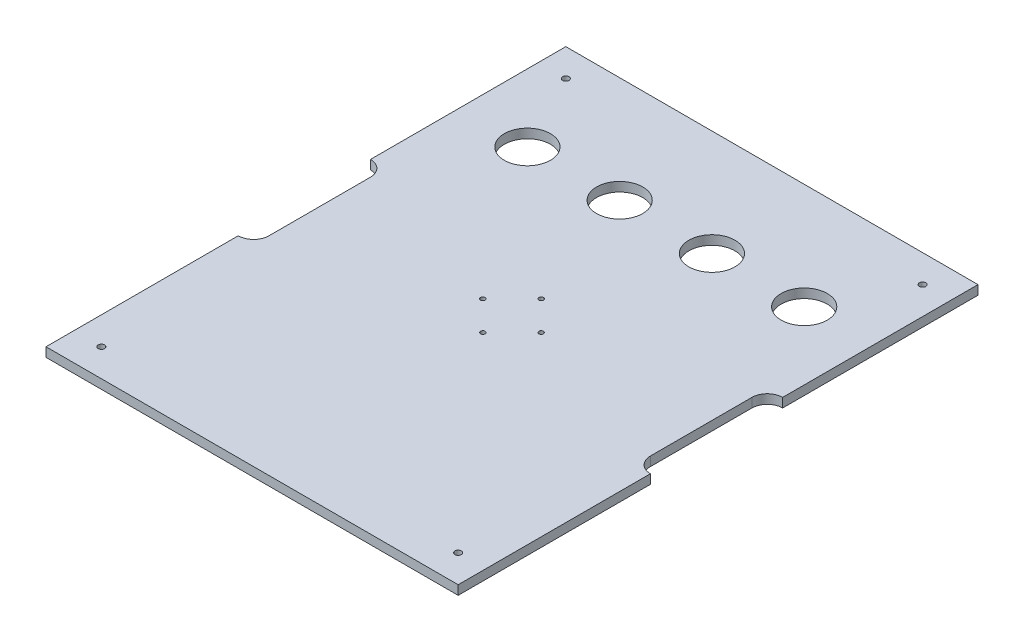
ISO-10303-21;
HEADER;
FILE_DESCRIPTION(('STEP AP214'),'2;1');
FILE_NAME('part.step','',(''),(''),'','','');
FILE_SCHEMA(('AUTOMOTIVE_DESIGN { 1 0 10303 214 1 1 1 1 }'));
ENDSEC;
DATA;
#1=APPLICATION_CONTEXT('core data for automotive mechanical design processes');
#2=APPLICATION_PROTOCOL_DEFINITION('international standard','automotive_design',2000,#1);
#3=PRODUCT_CONTEXT('',#1,'mechanical');
#4=PRODUCT('Part','Part','',(#3));
#5=PRODUCT_RELATED_PRODUCT_CATEGORY('part','',(#4));
#6=PRODUCT_DEFINITION_FORMATION('','',#4);
#7=PRODUCT_DEFINITION_CONTEXT('part definition',#1,'design');
#8=PRODUCT_DEFINITION('design','',#6,#7);
#9=PRODUCT_DEFINITION_SHAPE('','',#8);
#10=(LENGTH_UNIT() NAMED_UNIT(*) SI_UNIT(.MILLI.,.METRE.));
#11=(NAMED_UNIT(*) PLANE_ANGLE_UNIT() SI_UNIT($,.RADIAN.));
#12=(NAMED_UNIT(*) SI_UNIT($,.STERADIAN.) SOLID_ANGLE_UNIT());
#13=UNCERTAINTY_MEASURE_WITH_UNIT(LENGTH_MEASURE(1.E-05),#10,'distance_accuracy_value','');
#14=(GEOMETRIC_REPRESENTATION_CONTEXT(3) GLOBAL_UNCERTAINTY_ASSIGNED_CONTEXT((#13)) GLOBAL_UNIT_ASSIGNED_CONTEXT((#10,
#11,#12)) REPRESENTATION_CONTEXT('',''));
#15=CARTESIAN_POINT('',(0.,0.,0.));
#16=DIRECTION('',(0.,0.,1.));
#17=DIRECTION('',(1.,0.,0.));
#18=AXIS2_PLACEMENT_3D('',#15,#16,#17);
#19=CARTESIAN_POINT('',(134.,6.,-42.));
#20=DIRECTION('',(-1.,0.,0.));
#21=DIRECTION('',(0.,0.,1.));
#22=AXIS2_PLACEMENT_3D('',#19,#20,#21);
#23=PLANE('',#22);
#24=DIRECTION('',(0.,0.,-1.));
#25=VECTOR('',#24,1.);
#26=CARTESIAN_POINT('',(134.,0.,-42.));
#27=LINE('',#26,#25);
#28=CARTESIAN_POINT('',(134.,0.,-42.));
#29=VERTEX_POINT('',#28);
#30=CARTESIAN_POINT('',(134.,0.,-169.));
#31=VERTEX_POINT('',#30);
#32=EDGE_CURVE('E159',#29,#31,#27,.T.);
#33=ORIENTED_EDGE('',*,*,#32,.T.);
#34=DIRECTION('',(0.,-1.,0.));
#35=VECTOR('',#34,1.);
#36=CARTESIAN_POINT('',(134.,6.,-169.));
#37=LINE('',#36,#35);
#38=CARTESIAN_POINT('',(134.,6.,-169.));
#39=VERTEX_POINT('',#38);
#40=EDGE_CURVE('E11',#39,#31,#37,.T.);
#41=ORIENTED_EDGE('',*,*,#40,.F.);
#42=DIRECTION('',(0.,0.,-1.));
#43=VECTOR('',#42,1.);
#44=CARTESIAN_POINT('',(134.,6.,-42.));
#45=LINE('',#44,#43);
#46=CARTESIAN_POINT('',(134.,6.,-42.));
#47=VERTEX_POINT('',#46);
#48=EDGE_CURVE('E182',#47,#39,#45,.T.);
#49=ORIENTED_EDGE('',*,*,#48,.F.);
#50=DIRECTION('',(0.,-1.,0.));
#51=VECTOR('',#50,1.);
#52=CARTESIAN_POINT('',(134.,6.,-42.));
#53=LINE('',#52,#51);
#54=EDGE_CURVE('E155',#47,#29,#53,.T.);
#55=ORIENTED_EDGE('',*,*,#54,.T.);
#56=EDGE_LOOP('',(#33,#41,#49,#55));
#57=FACE_BOUND('',#56,.T.);
#58=ADVANCED_FACE('F39',(#57),#23,.F.);
#59=CARTESIAN_POINT('',(-134.,6.,-169.));
#60=DIRECTION('',(0.,0.,1.));
#61=DIRECTION('',(1.,0.,0.));
#62=AXIS2_PLACEMENT_3D('',#59,#60,#61);
#63=PLANE('',#62);
#64=DIRECTION('',(-1.,0.,0.));
#65=VECTOR('',#64,1.);
#66=CARTESIAN_POINT('',(-134.,0.,-169.));
#67=LINE('',#66,#65);
#68=CARTESIAN_POINT('',(-134.,0.,-169.));
#69=VERTEX_POINT('',#68);
#70=EDGE_CURVE('E162',#31,#69,#67,.T.);
#71=ORIENTED_EDGE('',*,*,#70,.T.);
#72=DIRECTION('',(0.,-1.,0.));
#73=VECTOR('',#72,1.);
#74=CARTESIAN_POINT('',(-134.,6.,-169.));
#75=LINE('',#74,#73);
#76=CARTESIAN_POINT('',(-134.,6.,-169.));
#77=VERTEX_POINT('',#76);
#78=EDGE_CURVE('E47',#77,#69,#75,.T.);
#79=ORIENTED_EDGE('',*,*,#78,.F.);
#80=DIRECTION('',(-1.,0.,0.));
#81=VECTOR('',#80,1.);
#82=CARTESIAN_POINT('',(-134.,6.,-169.));
#83=LINE('',#82,#81);
#84=EDGE_CURVE('E110',#39,#77,#83,.T.);
#85=ORIENTED_EDGE('',*,*,#84,.F.);
#86=ORIENTED_EDGE('',*,*,#40,.T.);
#87=EDGE_LOOP('',(#71,#79,#85,#86));
#88=FACE_BOUND('',#87,.T.);
#89=ADVANCED_FACE('F261',(#88),#63,.F.);
#90=CARTESIAN_POINT('',(-134.,6.,-42.));
#91=DIRECTION('',(1.,0.,0.));
#92=DIRECTION('',(0.,0.,-1.));
#93=AXIS2_PLACEMENT_3D('',#90,#91,#92);
#94=PLANE('',#93);
#95=DIRECTION('',(0.,0.,1.));
#96=VECTOR('',#95,1.);
#97=CARTESIAN_POINT('',(-134.,0.,-42.));
#98=LINE('',#97,#96);
#99=CARTESIAN_POINT('',(-134.,0.,-42.));
#100=VERTEX_POINT('',#99);
#101=EDGE_CURVE('E165',#69,#100,#98,.T.);
#102=ORIENTED_EDGE('',*,*,#101,.T.);
#103=DIRECTION('',(0.,-1.,0.));
#104=VECTOR('',#103,1.);
#105=CARTESIAN_POINT('',(-134.,6.,-42.));
#106=LINE('',#105,#104);
#107=CARTESIAN_POINT('',(-134.,6.,-42.));
#108=VERTEX_POINT('',#107);
#109=EDGE_CURVE('E201',#108,#100,#106,.T.);
#110=ORIENTED_EDGE('',*,*,#109,.F.);
#111=DIRECTION('',(0.,0.,1.));
#112=VECTOR('',#111,1.);
#113=CARTESIAN_POINT('',(-134.,6.,-42.));
#114=LINE('',#113,#112);
#115=EDGE_CURVE('E209',#77,#108,#114,.T.);
#116=ORIENTED_EDGE('',*,*,#115,.F.);
#117=ORIENTED_EDGE('',*,*,#78,.T.);
#118=EDGE_LOOP('',(#102,#110,#116,#117));
#119=FACE_BOUND('',#118,.T.);
#120=ADVANCED_FACE('F207',(#119),#94,.F.);
#121=CARTESIAN_POINT('',(-134.,6.,-32.));
#122=DIRECTION('',(0.,-1.,0.));
#123=DIRECTION('',(0.,0.,-1.));
#124=AXIS2_PLACEMENT_3D('',#121,#122,#123);
#125=CYLINDRICAL_SURFACE('',#124,10.);
#126=CARTESIAN_POINT('',(-134.,0.,-32.));
#127=DIRECTION('',(0.,-1.,0.));
#128=DIRECTION('',(0.,0.,1.));
#129=AXIS2_PLACEMENT_3D('',#126,#127,#128);
#130=CIRCLE('',#129,10.);
#131=CARTESIAN_POINT('',(-124.,0.,-32.));
#132=VERTEX_POINT('',#131);
#133=EDGE_CURVE('E167',#100,#132,#130,.T.);
#134=ORIENTED_EDGE('',*,*,#133,.T.);
#135=DIRECTION('',(0.,-1.,0.));
#136=VECTOR('',#135,1.);
#137=CARTESIAN_POINT('',(-124.,6.,-32.));
#138=LINE('',#137,#136);
#139=CARTESIAN_POINT('',(-124.,6.,-32.));
#140=VERTEX_POINT('',#139);
#141=EDGE_CURVE('E198',#140,#132,#138,.T.);
#142=ORIENTED_EDGE('',*,*,#141,.F.);
#143=CARTESIAN_POINT('',(-134.,6.,-32.));
#144=DIRECTION('',(0.,-1.,0.));
#145=DIRECTION('',(0.,0.,1.));
#146=AXIS2_PLACEMENT_3D('',#143,#144,#145);
#147=CIRCLE('',#146,10.);
#148=EDGE_CURVE('E227',#108,#140,#147,.T.);
#149=ORIENTED_EDGE('',*,*,#148,.F.);
#150=ORIENTED_EDGE('',*,*,#109,.T.);
#151=EDGE_LOOP('',(#134,#142,#149,#150));
#152=FACE_BOUND('',#151,.T.);
#153=ADVANCED_FACE('F218',(#152),#125,.F.);
#154=CARTESIAN_POINT('',(-124.,6.,34.));
#155=DIRECTION('',(1.,0.,0.));
#156=DIRECTION('',(0.,0.,-1.));
#157=AXIS2_PLACEMENT_3D('',#154,#155,#156);
#158=PLANE('',#157);
#159=DIRECTION('',(0.,0.,1.));
#160=VECTOR('',#159,1.);
#161=CARTESIAN_POINT('',(-124.,0.,34.));
#162=LINE('',#161,#160);
#163=CARTESIAN_POINT('',(-124.,0.,34.));
#164=VERTEX_POINT('',#163);
#165=EDGE_CURVE('E169',#132,#164,#162,.T.);
#166=ORIENTED_EDGE('',*,*,#165,.T.);
#167=DIRECTION('',(0.,-1.,0.));
#168=VECTOR('',#167,1.);
#169=CARTESIAN_POINT('',(-124.,6.,34.));
#170=LINE('',#169,#168);
#171=CARTESIAN_POINT('',(-124.,6.,34.));
#172=VERTEX_POINT('',#171);
#173=EDGE_CURVE('E195',#172,#164,#170,.T.);
#174=ORIENTED_EDGE('',*,*,#173,.F.);
#175=DIRECTION('',(0.,0.,1.));
#176=VECTOR('',#175,1.);
#177=CARTESIAN_POINT('',(-124.,6.,34.));
#178=LINE('',#177,#176);
#179=EDGE_CURVE('E224',#140,#172,#178,.T.);
#180=ORIENTED_EDGE('',*,*,#179,.F.);
#181=ORIENTED_EDGE('',*,*,#141,.T.);
#182=EDGE_LOOP('',(#166,#174,#180,#181));
#183=FACE_BOUND('',#182,.T.);
#184=ADVANCED_FACE('F222',(#183),#158,.F.);
#185=CARTESIAN_POINT('',(-134.,6.,34.));
#186=DIRECTION('',(0.,-1.,0.));
#187=DIRECTION('',(0.,0.,-1.));
#188=AXIS2_PLACEMENT_3D('',#185,#186,#187);
#189=CYLINDRICAL_SURFACE('',#188,10.);
#190=CARTESIAN_POINT('',(-134.,0.,34.));
#191=DIRECTION('',(0.,-1.,0.));
#192=DIRECTION('',(0.,0.,1.));
#193=AXIS2_PLACEMENT_3D('',#190,#191,#192);
#194=CIRCLE('',#193,10.);
#195=CARTESIAN_POINT('',(-134.,0.,44.));
#196=VERTEX_POINT('',#195);
#197=EDGE_CURVE('E171',#164,#196,#194,.T.);
#198=ORIENTED_EDGE('',*,*,#197,.T.);
#199=DIRECTION('',(0.,-1.,0.));
#200=VECTOR('',#199,1.);
#201=CARTESIAN_POINT('',(-134.,6.,44.));
#202=LINE('',#201,#200);
#203=CARTESIAN_POINT('',(-134.,6.,44.));
#204=VERTEX_POINT('',#203);
#205=EDGE_CURVE('E192',#204,#196,#202,.T.);
#206=ORIENTED_EDGE('',*,*,#205,.F.);
#207=CARTESIAN_POINT('',(-134.,6.,34.));
#208=DIRECTION('',(0.,-1.,0.));
#209=DIRECTION('',(0.,0.,1.));
#210=AXIS2_PLACEMENT_3D('',#207,#208,#209);
#211=CIRCLE('',#210,10.);
#212=EDGE_CURVE('E226',#172,#204,#211,.T.);
#213=ORIENTED_EDGE('',*,*,#212,.F.);
#214=ORIENTED_EDGE('',*,*,#173,.T.);
#215=EDGE_LOOP('',(#198,#206,#213,#214));
#216=FACE_BOUND('',#215,.T.);
#217=ADVANCED_FACE('F274',(#216),#189,.F.);
#218=CARTESIAN_POINT('',(-134.,6.,169.));
#219=DIRECTION('',(1.,0.,0.));
#220=DIRECTION('',(0.,0.,-1.));
#221=AXIS2_PLACEMENT_3D('',#218,#219,#220);
#222=PLANE('',#221);
#223=DIRECTION('',(0.,0.,1.));
#224=VECTOR('',#223,1.);
#225=CARTESIAN_POINT('',(-134.,0.,169.));
#226=LINE('',#225,#224);
#227=CARTESIAN_POINT('',(-134.,0.,169.));
#228=VERTEX_POINT('',#227);
#229=EDGE_CURVE('E173',#196,#228,#226,.T.);
#230=ORIENTED_EDGE('',*,*,#229,.T.);
#231=DIRECTION('',(0.,-1.,0.));
#232=VECTOR('',#231,1.);
#233=CARTESIAN_POINT('',(-134.,6.,169.));
#234=LINE('',#233,#232);
#235=CARTESIAN_POINT('',(-134.,6.,169.));
#236=VERTEX_POINT('',#235);
#237=EDGE_CURVE('E189',#236,#228,#234,.T.);
#238=ORIENTED_EDGE('',*,*,#237,.F.);
#239=DIRECTION('',(0.,0.,1.));
#240=VECTOR('',#239,1.);
#241=CARTESIAN_POINT('',(-134.,6.,169.));
#242=LINE('',#241,#240);
#243=EDGE_CURVE('E229',#204,#236,#242,.T.);
#244=ORIENTED_EDGE('',*,*,#243,.F.);
#245=ORIENTED_EDGE('',*,*,#205,.T.);
#246=EDGE_LOOP('',(#230,#238,#244,#245));
#247=FACE_BOUND('',#246,.T.);
#248=ADVANCED_FACE('F277',(#247),#222,.F.);
#249=CARTESIAN_POINT('',(-134.,6.,169.));
#250=DIRECTION('',(0.,0.,-1.));
#251=DIRECTION('',(-1.,0.,0.));
#252=AXIS2_PLACEMENT_3D('',#249,#250,#251);
#253=PLANE('',#252);
#254=DIRECTION('',(1.,0.,0.));
#255=VECTOR('',#254,1.);
#256=CARTESIAN_POINT('',(-134.,0.,169.));
#257=LINE('',#256,#255);
#258=CARTESIAN_POINT('',(134.,0.,169.));
#259=VERTEX_POINT('',#258);
#260=EDGE_CURVE('E175',#228,#259,#257,.T.);
#261=ORIENTED_EDGE('',*,*,#260,.T.);
#262=DIRECTION('',(0.,-1.,0.));
#263=VECTOR('',#262,1.);
#264=CARTESIAN_POINT('',(134.,6.,169.));
#265=LINE('',#264,#263);
#266=CARTESIAN_POINT('',(134.,6.,169.));
#267=VERTEX_POINT('',#266);
#268=EDGE_CURVE('E186',#267,#259,#265,.T.);
#269=ORIENTED_EDGE('',*,*,#268,.F.);
#270=DIRECTION('',(1.,0.,0.));
#271=VECTOR('',#270,1.);
#272=CARTESIAN_POINT('',(-134.,6.,169.));
#273=LINE('',#272,#271);
#274=EDGE_CURVE('E235',#236,#267,#273,.T.);
#275=ORIENTED_EDGE('',*,*,#274,.F.);
#276=ORIENTED_EDGE('',*,*,#237,.T.);
#277=EDGE_LOOP('',(#261,#269,#275,#276));
#278=FACE_BOUND('',#277,.T.);
#279=ADVANCED_FACE('F241',(#278),#253,.F.);
#280=CARTESIAN_POINT('',(134.,6.,169.));
#281=DIRECTION('',(-1.,0.,0.));
#282=DIRECTION('',(0.,0.,1.));
#283=AXIS2_PLACEMENT_3D('',#280,#281,#282);
#284=PLANE('',#283);
#285=DIRECTION('',(0.,0.,-1.));
#286=VECTOR('',#285,1.);
#287=CARTESIAN_POINT('',(134.,0.,169.));
#288=LINE('',#287,#286);
#289=CARTESIAN_POINT('',(134.,0.,44.));
#290=VERTEX_POINT('',#289);
#291=EDGE_CURVE('E177',#259,#290,#288,.T.);
#292=ORIENTED_EDGE('',*,*,#291,.T.);
#293=DIRECTION('',(0.,-1.,0.));
#294=VECTOR('',#293,1.);
#295=CARTESIAN_POINT('',(134.,6.,44.));
#296=LINE('',#295,#294);
#297=CARTESIAN_POINT('',(134.,6.,44.));
#298=VERTEX_POINT('',#297);
#299=EDGE_CURVE('E150',#298,#290,#296,.T.);
#300=ORIENTED_EDGE('',*,*,#299,.F.);
#301=DIRECTION('',(0.,0.,-1.));
#302=VECTOR('',#301,1.);
#303=CARTESIAN_POINT('',(134.,6.,169.));
#304=LINE('',#303,#302);
#305=EDGE_CURVE('E141',#267,#298,#304,.T.);
#306=ORIENTED_EDGE('',*,*,#305,.F.);
#307=ORIENTED_EDGE('',*,*,#268,.T.);
#308=EDGE_LOOP('',(#292,#300,#306,#307));
#309=FACE_BOUND('',#308,.T.);
#310=ADVANCED_FACE('F245',(#309),#284,.F.);
#311=CARTESIAN_POINT('',(134.,6.,34.));
#312=DIRECTION('',(0.,-1.,0.));
#313=DIRECTION('',(0.,0.,-1.));
#314=AXIS2_PLACEMENT_3D('',#311,#312,#313);
#315=CYLINDRICAL_SURFACE('',#314,10.);
#316=CARTESIAN_POINT('',(134.,0.,34.));
#317=DIRECTION('',(0.,-1.,0.));
#318=DIRECTION('',(0.,0.,1.));
#319=AXIS2_PLACEMENT_3D('',#316,#317,#318);
#320=CIRCLE('',#319,10.);
#321=CARTESIAN_POINT('',(124.,0.,34.));
#322=VERTEX_POINT('',#321);
#323=EDGE_CURVE('E149',#290,#322,#320,.T.);
#324=ORIENTED_EDGE('',*,*,#323,.T.);
#325=DIRECTION('',(0.,-1.,0.));
#326=VECTOR('',#325,1.);
#327=CARTESIAN_POINT('',(124.,6.,34.));
#328=LINE('',#327,#326);
#329=CARTESIAN_POINT('',(124.,6.,34.));
#330=VERTEX_POINT('',#329);
#331=EDGE_CURVE('E146',#330,#322,#328,.T.);
#332=ORIENTED_EDGE('',*,*,#331,.F.);
#333=CARTESIAN_POINT('',(134.,6.,34.));
#334=DIRECTION('',(0.,-1.,0.));
#335=DIRECTION('',(0.,0.,1.));
#336=AXIS2_PLACEMENT_3D('',#333,#334,#335);
#337=CIRCLE('',#336,10.);
#338=EDGE_CURVE('E135',#298,#330,#337,.T.);
#339=ORIENTED_EDGE('',*,*,#338,.F.);
#340=ORIENTED_EDGE('',*,*,#299,.T.);
#341=EDGE_LOOP('',(#324,#332,#339,#340));
#342=FACE_BOUND('',#341,.T.);
#343=ADVANCED_FACE('F147',(#342),#315,.F.);
#344=CARTESIAN_POINT('',(124.,6.,34.));
#345=DIRECTION('',(-1.,0.,0.));
#346=DIRECTION('',(0.,0.,1.));
#347=AXIS2_PLACEMENT_3D('',#344,#345,#346);
#348=PLANE('',#347);
#349=DIRECTION('',(0.,0.,-1.));
#350=VECTOR('',#349,1.);
#351=CARTESIAN_POINT('',(124.,0.,34.));
#352=LINE('',#351,#350);
#353=CARTESIAN_POINT('',(124.,0.,-32.));
#354=VERTEX_POINT('',#353);
#355=EDGE_CURVE('E96',#322,#354,#352,.T.);
#356=ORIENTED_EDGE('',*,*,#355,.T.);
#357=DIRECTION('',(0.,-1.,0.));
#358=VECTOR('',#357,1.);
#359=CARTESIAN_POINT('',(124.,6.,-32.));
#360=LINE('',#359,#358);
#361=CARTESIAN_POINT('',(124.,6.,-32.));
#362=VERTEX_POINT('',#361);
#363=EDGE_CURVE('E151',#362,#354,#360,.T.);
#364=ORIENTED_EDGE('',*,*,#363,.F.);
#365=DIRECTION('',(0.,0.,-1.));
#366=VECTOR('',#365,1.);
#367=CARTESIAN_POINT('',(124.,6.,34.));
#368=LINE('',#367,#366);
#369=EDGE_CURVE('E139',#330,#362,#368,.T.);
#370=ORIENTED_EDGE('',*,*,#369,.F.);
#371=ORIENTED_EDGE('',*,*,#331,.T.);
#372=EDGE_LOOP('',(#356,#364,#370,#371));
#373=FACE_BOUND('',#372,.T.);
#374=ADVANCED_FACE('F153',(#373),#348,.F.);
#375=CARTESIAN_POINT('',(134.,6.,-32.));
#376=DIRECTION('',(0.,-1.,0.));
#377=DIRECTION('',(0.,0.,-1.));
#378=AXIS2_PLACEMENT_3D('',#375,#376,#377);
#379=CYLINDRICAL_SURFACE('',#378,10.);
#380=CARTESIAN_POINT('',(134.,0.,-32.));
#381=DIRECTION('',(0.,-1.,0.));
#382=DIRECTION('',(0.,0.,1.));
#383=AXIS2_PLACEMENT_3D('',#380,#381,#382);
#384=CIRCLE('',#383,10.);
#385=EDGE_CURVE('E102',#354,#29,#384,.T.);
#386=ORIENTED_EDGE('',*,*,#385,.T.);
#387=ORIENTED_EDGE('',*,*,#54,.F.);
#388=CARTESIAN_POINT('',(134.,6.,-32.));
#389=DIRECTION('',(0.,-1.,0.));
#390=DIRECTION('',(0.,0.,1.));
#391=AXIS2_PLACEMENT_3D('',#388,#389,#390);
#392=CIRCLE('',#391,10.);
#393=EDGE_CURVE('E55',#362,#47,#392,.T.);
#394=ORIENTED_EDGE('',*,*,#393,.F.);
#395=ORIENTED_EDGE('',*,*,#363,.T.);
#396=EDGE_LOOP('',(#386,#387,#394,#395));
#397=FACE_BOUND('',#396,.T.);
#398=ADVANCED_FACE('F249',(#397),#379,.F.);
#399=CARTESIAN_POINT('',(-134.,6.,-32.));
#400=DIRECTION('',(0.,1.,0.));
#401=DIRECTION('',(0.,0.,1.));
#402=AXIS2_PLACEMENT_3D('',#399,#400,#401);
#403=PLANE('',#402);
#404=CARTESIAN_POINT('',(115.999999999999,6.,-151.));
#405=DIRECTION('',(0.,-1.,0.));
#406=DIRECTION('',(0.,0.,-1.));
#407=AXIS2_PLACEMENT_3D('',#404,#405,#406);
#408=CIRCLE('',#407,2.1);
#409=CARTESIAN_POINT('',(115.999999999999,6.,-153.1));
#410=VERTEX_POINT('',#409);
#411=EDGE_CURVE('E542',#410,#410,#408,.T.);
#412=ORIENTED_EDGE('',*,*,#411,.T.);
#413=EDGE_LOOP('',(#412));
#414=FACE_BOUND('',#413,.T.);
#415=CARTESIAN_POINT('',(116.,6.,151.));
#416=DIRECTION('',(0.,-1.,0.));
#417=DIRECTION('',(0.,0.,-1.));
#418=AXIS2_PLACEMENT_3D('',#415,#416,#417);
#419=CIRCLE('',#418,2.1);
#420=CARTESIAN_POINT('',(116.,6.,148.9));
#421=VERTEX_POINT('',#420);
#422=EDGE_CURVE('E552',#421,#421,#419,.T.);
#423=ORIENTED_EDGE('',*,*,#422,.T.);
#424=EDGE_LOOP('',(#423));
#425=FACE_BOUND('',#424,.T.);
#426=CARTESIAN_POINT('',(-116.,6.,-151.));
#427=DIRECTION('',(0.,-1.,0.));
#428=DIRECTION('',(0.,0.,-1.));
#429=AXIS2_PLACEMENT_3D('',#426,#427,#428);
#430=CIRCLE('',#429,2.1);
#431=CARTESIAN_POINT('',(-116.,6.,-153.1));
#432=VERTEX_POINT('',#431);
#433=EDGE_CURVE('E558',#432,#432,#430,.T.);
#434=ORIENTED_EDGE('',*,*,#433,.T.);
#435=EDGE_LOOP('',(#434));
#436=FACE_BOUND('',#435,.T.);
#437=CARTESIAN_POINT('',(-116.,6.,151.));
#438=DIRECTION('',(0.,-1.,0.));
#439=DIRECTION('',(0.,0.,-1.));
#440=AXIS2_PLACEMENT_3D('',#437,#438,#439);
#441=CIRCLE('',#440,2.1);
#442=CARTESIAN_POINT('',(-116.,6.,148.9));
#443=VERTEX_POINT('',#442);
#444=EDGE_CURVE('E564',#443,#443,#441,.T.);
#445=ORIENTED_EDGE('',*,*,#444,.T.);
#446=EDGE_LOOP('',(#445));
#447=FACE_BOUND('',#446,.T.);
#448=CARTESIAN_POINT('',(-90.,6.,-100.));
#449=DIRECTION('',(0.,1.,0.));
#450=DIRECTION('',(0.,0.,1.));
#451=AXIS2_PLACEMENT_3D('',#448,#449,#450);
#452=CIRCLE('',#451,15.);
#453=CARTESIAN_POINT('',(-90.,6.,-85.));
#454=VERTEX_POINT('',#453);
#455=EDGE_CURVE('E572',#454,#454,#452,.T.);
#456=ORIENTED_EDGE('',*,*,#455,.F.);
#457=EDGE_LOOP('',(#456));
#458=FACE_BOUND('',#457,.T.);
#459=CARTESIAN_POINT('',(-30.,6.,-100.));
#460=DIRECTION('',(0.,1.,0.));
#461=DIRECTION('',(0.,0.,1.));
#462=AXIS2_PLACEMENT_3D('',#459,#460,#461);
#463=CIRCLE('',#462,15.);
#464=CARTESIAN_POINT('',(-30.,6.,-85.));
#465=VERTEX_POINT('',#464);
#466=EDGE_CURVE('E575',#465,#465,#463,.T.);
#467=ORIENTED_EDGE('',*,*,#466,.F.);
#468=EDGE_LOOP('',(#467));
#469=FACE_BOUND('',#468,.T.);
#470=CARTESIAN_POINT('',(30.,6.,-100.));
#471=DIRECTION('',(0.,1.,0.));
#472=DIRECTION('',(0.,0.,1.));
#473=AXIS2_PLACEMENT_3D('',#470,#471,#472);
#474=CIRCLE('',#473,15.);
#475=CARTESIAN_POINT('',(30.,6.,-85.));
#476=VERTEX_POINT('',#475);
#477=EDGE_CURVE('E581',#476,#476,#474,.T.);
#478=ORIENTED_EDGE('',*,*,#477,.F.);
#479=EDGE_LOOP('',(#478));
#480=FACE_BOUND('',#479,.T.);
#481=CARTESIAN_POINT('',(90.,6.,-100.));
#482=DIRECTION('',(0.,1.,0.));
#483=DIRECTION('',(0.,0.,1.));
#484=AXIS2_PLACEMENT_3D('',#481,#482,#483);
#485=CIRCLE('',#484,15.);
#486=CARTESIAN_POINT('',(90.,6.,-85.));
#487=VERTEX_POINT('',#486);
#488=EDGE_CURVE('E587',#487,#487,#485,.T.);
#489=ORIENTED_EDGE('',*,*,#488,.F.);
#490=EDGE_LOOP('',(#489));
#491=FACE_BOUND('',#490,.T.);
#492=CARTESIAN_POINT('',(0.,6.,-19.));
#493=DIRECTION('',(0.,-1.,0.));
#494=DIRECTION('',(0.,0.,-1.));
#495=AXIS2_PLACEMENT_3D('',#492,#493,#494);
#496=CIRCLE('',#495,1.5);
#497=CARTESIAN_POINT('',(0.,6.,-20.5));
#498=VERTEX_POINT('',#497);
#499=EDGE_CURVE('E594',#498,#498,#496,.T.);
#500=ORIENTED_EDGE('',*,*,#499,.T.);
#501=EDGE_LOOP('',(#500));
#502=FACE_BOUND('',#501,.T.);
#503=CARTESIAN_POINT('',(19.,6.,0.));
#504=DIRECTION('',(0.,-1.,0.));
#505=DIRECTION('',(0.,0.,-1.));
#506=AXIS2_PLACEMENT_3D('',#503,#504,#505);
#507=CIRCLE('',#506,1.5);
#508=CARTESIAN_POINT('',(19.,6.,-1.5));
#509=VERTEX_POINT('',#508);
#510=EDGE_CURVE('E600',#509,#509,#507,.T.);
#511=ORIENTED_EDGE('',*,*,#510,.T.);
#512=EDGE_LOOP('',(#511));
#513=FACE_BOUND('',#512,.T.);
#514=CARTESIAN_POINT('',(0.,6.,19.));
#515=DIRECTION('',(0.,-1.,0.));
#516=DIRECTION('',(0.,0.,-1.));
#517=AXIS2_PLACEMENT_3D('',#514,#515,#516);
#518=CIRCLE('',#517,1.5);
#519=CARTESIAN_POINT('',(0.,6.,17.5));
#520=VERTEX_POINT('',#519);
#521=EDGE_CURVE('E606',#520,#520,#518,.T.);
#522=ORIENTED_EDGE('',*,*,#521,.T.);
#523=EDGE_LOOP('',(#522));
#524=FACE_BOUND('',#523,.T.);
#525=CARTESIAN_POINT('',(-19.,6.,0.));
#526=DIRECTION('',(0.,-1.,0.));
#527=DIRECTION('',(0.,0.,-1.));
#528=AXIS2_PLACEMENT_3D('',#525,#526,#527);
#529=CIRCLE('',#528,1.5);
#530=CARTESIAN_POINT('',(-19.,6.,-1.5));
#531=VERTEX_POINT('',#530);
#532=EDGE_CURVE('E163',#531,#531,#529,.T.);
#533=ORIENTED_EDGE('',*,*,#532,.T.);
#534=EDGE_LOOP('',(#533));
#535=FACE_BOUND('',#534,.T.);
#536=ORIENTED_EDGE('',*,*,#48,.T.);
#537=ORIENTED_EDGE('',*,*,#84,.T.);
#538=ORIENTED_EDGE('',*,*,#115,.T.);
#539=ORIENTED_EDGE('',*,*,#148,.T.);
#540=ORIENTED_EDGE('',*,*,#179,.T.);
#541=ORIENTED_EDGE('',*,*,#212,.T.);
#542=ORIENTED_EDGE('',*,*,#243,.T.);
#543=ORIENTED_EDGE('',*,*,#274,.T.);
#544=ORIENTED_EDGE('',*,*,#305,.T.);
#545=ORIENTED_EDGE('',*,*,#338,.T.);
#546=ORIENTED_EDGE('',*,*,#369,.T.);
#547=ORIENTED_EDGE('',*,*,#393,.T.);
#548=EDGE_LOOP('',(#536,#537,#538,#539,#540,#541,#542,#543,#544,#545,#546,#547));
#549=FACE_BOUND('',#548,.T.);
#550=ADVANCED_FACE('F137',(#414,#425,#436,#447,#458,#469,#480,#491,#502,#513,#524,#535,#549),
#403,.T.);
#551=CARTESIAN_POINT('',(-134.,0.,-32.));
#552=DIRECTION('',(0.,1.,0.));
#553=DIRECTION('',(0.,0.,1.));
#554=AXIS2_PLACEMENT_3D('',#551,#552,#553);
#555=PLANE('',#554);
#556=CARTESIAN_POINT('',(115.999999999999,0.,-151.));
#557=DIRECTION('',(0.,-1.,0.));
#558=DIRECTION('',(0.,0.,-1.));
#559=AXIS2_PLACEMENT_3D('',#556,#557,#558);
#560=CIRCLE('',#559,2.1);
#561=CARTESIAN_POINT('',(115.999999999999,0.,-153.1));
#562=VERTEX_POINT('',#561);
#563=EDGE_CURVE('E545',#562,#562,#560,.T.);
#564=ORIENTED_EDGE('',*,*,#563,.F.);
#565=EDGE_LOOP('',(#564));
#566=FACE_BOUND('',#565,.T.);
#567=CARTESIAN_POINT('',(116.,0.,151.));
#568=DIRECTION('',(0.,-1.,0.));
#569=DIRECTION('',(0.,0.,-1.));
#570=AXIS2_PLACEMENT_3D('',#567,#568,#569);
#571=CIRCLE('',#570,2.1);
#572=CARTESIAN_POINT('',(116.,0.,148.9));
#573=VERTEX_POINT('',#572);
#574=EDGE_CURVE('E547',#573,#573,#571,.T.);
#575=ORIENTED_EDGE('',*,*,#574,.F.);
#576=EDGE_LOOP('',(#575));
#577=FACE_BOUND('',#576,.T.);
#578=CARTESIAN_POINT('',(-116.,0.,-151.));
#579=DIRECTION('',(0.,-1.,0.));
#580=DIRECTION('',(0.,0.,-1.));
#581=AXIS2_PLACEMENT_3D('',#578,#579,#580);
#582=CIRCLE('',#581,2.1);
#583=CARTESIAN_POINT('',(-116.,0.,-153.1));
#584=VERTEX_POINT('',#583);
#585=EDGE_CURVE('E555',#584,#584,#582,.T.);
#586=ORIENTED_EDGE('',*,*,#585,.F.);
#587=EDGE_LOOP('',(#586));
#588=FACE_BOUND('',#587,.T.);
#589=CARTESIAN_POINT('',(-116.,0.,151.));
#590=DIRECTION('',(0.,-1.,0.));
#591=DIRECTION('',(0.,0.,-1.));
#592=AXIS2_PLACEMENT_3D('',#589,#590,#591);
#593=CIRCLE('',#592,2.1);
#594=CARTESIAN_POINT('',(-116.,0.,148.9));
#595=VERTEX_POINT('',#594);
#596=EDGE_CURVE('E561',#595,#595,#593,.T.);
#597=ORIENTED_EDGE('',*,*,#596,.F.);
#598=EDGE_LOOP('',(#597));
#599=FACE_BOUND('',#598,.T.);
#600=CARTESIAN_POINT('',(-90.,0.,-100.));
#601=DIRECTION('',(0.,1.,0.));
#602=DIRECTION('',(0.,0.,1.));
#603=AXIS2_PLACEMENT_3D('',#600,#601,#602);
#604=CIRCLE('',#603,15.);
#605=CARTESIAN_POINT('',(-90.,0.,-85.));
#606=VERTEX_POINT('',#605);
#607=EDGE_CURVE('E568',#606,#606,#604,.T.);
#608=ORIENTED_EDGE('',*,*,#607,.T.);
#609=EDGE_LOOP('',(#608));
#610=FACE_BOUND('',#609,.T.);
#611=CARTESIAN_POINT('',(-30.,0.,-100.));
#612=DIRECTION('',(0.,1.,0.));
#613=DIRECTION('',(0.,0.,1.));
#614=AXIS2_PLACEMENT_3D('',#611,#612,#613);
#615=CIRCLE('',#614,15.);
#616=CARTESIAN_POINT('',(-30.,0.,-85.));
#617=VERTEX_POINT('',#616);
#618=EDGE_CURVE('E578',#617,#617,#615,.T.);
#619=ORIENTED_EDGE('',*,*,#618,.T.);
#620=EDGE_LOOP('',(#619));
#621=FACE_BOUND('',#620,.T.);
#622=CARTESIAN_POINT('',(30.,0.,-100.));
#623=DIRECTION('',(0.,1.,0.));
#624=DIRECTION('',(0.,0.,1.));
#625=AXIS2_PLACEMENT_3D('',#622,#623,#624);
#626=CIRCLE('',#625,15.);
#627=CARTESIAN_POINT('',(30.,0.,-85.));
#628=VERTEX_POINT('',#627);
#629=EDGE_CURVE('E584',#628,#628,#626,.T.);
#630=ORIENTED_EDGE('',*,*,#629,.T.);
#631=EDGE_LOOP('',(#630));
#632=FACE_BOUND('',#631,.T.);
#633=CARTESIAN_POINT('',(90.,0.,-100.));
#634=DIRECTION('',(0.,1.,0.));
#635=DIRECTION('',(0.,0.,1.));
#636=AXIS2_PLACEMENT_3D('',#633,#634,#635);
#637=CIRCLE('',#636,15.);
#638=CARTESIAN_POINT('',(90.,0.,-85.));
#639=VERTEX_POINT('',#638);
#640=EDGE_CURVE('E567',#639,#639,#637,.T.);
#641=ORIENTED_EDGE('',*,*,#640,.T.);
#642=EDGE_LOOP('',(#641));
#643=FACE_BOUND('',#642,.T.);
#644=CARTESIAN_POINT('',(0.,0.,-19.));
#645=DIRECTION('',(0.,-1.,0.));
#646=DIRECTION('',(0.,0.,-1.));
#647=AXIS2_PLACEMENT_3D('',#644,#645,#646);
#648=CIRCLE('',#647,1.5);
#649=CARTESIAN_POINT('',(0.,0.,-20.5));
#650=VERTEX_POINT('',#649);
#651=EDGE_CURVE('E571',#650,#650,#648,.T.);
#652=ORIENTED_EDGE('',*,*,#651,.F.);
#653=EDGE_LOOP('',(#652));
#654=FACE_BOUND('',#653,.T.);
#655=CARTESIAN_POINT('',(19.,0.,0.));
#656=DIRECTION('',(0.,-1.,0.));
#657=DIRECTION('',(0.,0.,-1.));
#658=AXIS2_PLACEMENT_3D('',#655,#656,#657);
#659=CIRCLE('',#658,1.5);
#660=CARTESIAN_POINT('',(19.,0.,-1.5));
#661=VERTEX_POINT('',#660);
#662=EDGE_CURVE('E597',#661,#661,#659,.T.);
#663=ORIENTED_EDGE('',*,*,#662,.F.);
#664=EDGE_LOOP('',(#663));
#665=FACE_BOUND('',#664,.T.);
#666=CARTESIAN_POINT('',(0.,0.,19.));
#667=DIRECTION('',(0.,-1.,0.));
#668=DIRECTION('',(0.,0.,-1.));
#669=AXIS2_PLACEMENT_3D('',#666,#667,#668);
#670=CIRCLE('',#669,1.5);
#671=CARTESIAN_POINT('',(0.,0.,17.5));
#672=VERTEX_POINT('',#671);
#673=EDGE_CURVE('E603',#672,#672,#670,.T.);
#674=ORIENTED_EDGE('',*,*,#673,.F.);
#675=EDGE_LOOP('',(#674));
#676=FACE_BOUND('',#675,.T.);
#677=CARTESIAN_POINT('',(-19.,0.,0.));
#678=DIRECTION('',(0.,-1.,0.));
#679=DIRECTION('',(0.,0.,-1.));
#680=AXIS2_PLACEMENT_3D('',#677,#678,#679);
#681=CIRCLE('',#680,1.5);
#682=CARTESIAN_POINT('',(-19.,0.,-1.5));
#683=VERTEX_POINT('',#682);
#684=EDGE_CURVE('E609',#683,#683,#681,.T.);
#685=ORIENTED_EDGE('',*,*,#684,.F.);
#686=EDGE_LOOP('',(#685));
#687=FACE_BOUND('',#686,.T.);
#688=ORIENTED_EDGE('',*,*,#32,.F.);
#689=ORIENTED_EDGE('',*,*,#385,.F.);
#690=ORIENTED_EDGE('',*,*,#355,.F.);
#691=ORIENTED_EDGE('',*,*,#323,.F.);
#692=ORIENTED_EDGE('',*,*,#291,.F.);
#693=ORIENTED_EDGE('',*,*,#260,.F.);
#694=ORIENTED_EDGE('',*,*,#229,.F.);
#695=ORIENTED_EDGE('',*,*,#197,.F.);
#696=ORIENTED_EDGE('',*,*,#165,.F.);
#697=ORIENTED_EDGE('',*,*,#133,.F.);
#698=ORIENTED_EDGE('',*,*,#101,.F.);
#699=ORIENTED_EDGE('',*,*,#70,.F.);
#700=EDGE_LOOP('',(#688,#689,#690,#691,#692,#693,#694,#695,#696,#697,#698,#699));
#701=FACE_BOUND('',#700,.T.);
#702=ADVANCED_FACE('F213',(#566,#577,#588,#599,#610,#621,#632,#643,#654,#665,#676,#687,#701),
#555,.F.);
#703=CARTESIAN_POINT('',(-19.,0.,0.));
#704=DIRECTION('',(0.,-1.,0.));
#705=DIRECTION('',(0.,0.,-1.));
#706=AXIS2_PLACEMENT_3D('',#703,#704,#705);
#707=CYLINDRICAL_SURFACE('',#706,1.5);
#708=ORIENTED_EDGE('',*,*,#532,.F.);
#709=EDGE_LOOP('',(#708));
#710=FACE_BOUND('',#709,.T.);
#711=ORIENTED_EDGE('',*,*,#684,.T.);
#712=EDGE_LOOP('',(#711));
#713=FACE_BOUND('',#712,.T.);
#714=ADVANCED_FACE('F307',(#710,#713),#707,.F.);
#715=CARTESIAN_POINT('',(0.,0.,19.));
#716=DIRECTION('',(0.,-1.,0.));
#717=DIRECTION('',(0.,0.,-1.));
#718=AXIS2_PLACEMENT_3D('',#715,#716,#717);
#719=CYLINDRICAL_SURFACE('',#718,1.5);
#720=ORIENTED_EDGE('',*,*,#521,.F.);
#721=EDGE_LOOP('',(#720));
#722=FACE_BOUND('',#721,.T.);
#723=ORIENTED_EDGE('',*,*,#673,.T.);
#724=EDGE_LOOP('',(#723));
#725=FACE_BOUND('',#724,.T.);
#726=ADVANCED_FACE('F312',(#722,#725),#719,.F.);
#727=CARTESIAN_POINT('',(19.,0.,0.));
#728=DIRECTION('',(0.,-1.,0.));
#729=DIRECTION('',(0.,0.,-1.));
#730=AXIS2_PLACEMENT_3D('',#727,#728,#729);
#731=CYLINDRICAL_SURFACE('',#730,1.5);
#732=ORIENTED_EDGE('',*,*,#510,.F.);
#733=EDGE_LOOP('',(#732));
#734=FACE_BOUND('',#733,.T.);
#735=ORIENTED_EDGE('',*,*,#662,.T.);
#736=EDGE_LOOP('',(#735));
#737=FACE_BOUND('',#736,.T.);
#738=ADVANCED_FACE('F325',(#734,#737),#731,.F.);
#739=CARTESIAN_POINT('',(0.,0.,-19.));
#740=DIRECTION('',(0.,-1.,0.));
#741=DIRECTION('',(0.,0.,-1.));
#742=AXIS2_PLACEMENT_3D('',#739,#740,#741);
#743=CYLINDRICAL_SURFACE('',#742,1.5);
#744=ORIENTED_EDGE('',*,*,#499,.F.);
#745=EDGE_LOOP('',(#744));
#746=FACE_BOUND('',#745,.T.);
#747=ORIENTED_EDGE('',*,*,#651,.T.);
#748=EDGE_LOOP('',(#747));
#749=FACE_BOUND('',#748,.T.);
#750=ADVANCED_FACE('F336',(#746,#749),#743,.F.);
#751=CARTESIAN_POINT('',(90.,0.,-100.));
#752=DIRECTION('',(0.,1.,0.));
#753=DIRECTION('',(0.,0.,1.));
#754=AXIS2_PLACEMENT_3D('',#751,#752,#753);
#755=CYLINDRICAL_SURFACE('',#754,15.);
#756=ORIENTED_EDGE('',*,*,#640,.F.);
#757=EDGE_LOOP('',(#756));
#758=FACE_BOUND('',#757,.T.);
#759=ORIENTED_EDGE('',*,*,#488,.T.);
#760=EDGE_LOOP('',(#759));
#761=FACE_BOUND('',#760,.T.);
#762=ADVANCED_FACE('F347',(#758,#761),#755,.F.);
#763=CARTESIAN_POINT('',(30.,0.,-100.));
#764=DIRECTION('',(0.,1.,0.));
#765=DIRECTION('',(0.,0.,1.));
#766=AXIS2_PLACEMENT_3D('',#763,#764,#765);
#767=CYLINDRICAL_SURFACE('',#766,15.);
#768=ORIENTED_EDGE('',*,*,#629,.F.);
#769=EDGE_LOOP('',(#768));
#770=FACE_BOUND('',#769,.T.);
#771=ORIENTED_EDGE('',*,*,#477,.T.);
#772=EDGE_LOOP('',(#771));
#773=FACE_BOUND('',#772,.T.);
#774=ADVANCED_FACE('F358',(#770,#773),#767,.F.);
#775=CARTESIAN_POINT('',(-30.,0.,-100.));
#776=DIRECTION('',(0.,1.,0.));
#777=DIRECTION('',(0.,0.,1.));
#778=AXIS2_PLACEMENT_3D('',#775,#776,#777);
#779=CYLINDRICAL_SURFACE('',#778,15.);
#780=ORIENTED_EDGE('',*,*,#618,.F.);
#781=EDGE_LOOP('',(#780));
#782=FACE_BOUND('',#781,.T.);
#783=ORIENTED_EDGE('',*,*,#466,.T.);
#784=EDGE_LOOP('',(#783));
#785=FACE_BOUND('',#784,.T.);
#786=ADVANCED_FACE('F369',(#782,#785),#779,.F.);
#787=CARTESIAN_POINT('',(-90.,0.,-100.));
#788=DIRECTION('',(0.,1.,0.));
#789=DIRECTION('',(0.,0.,1.));
#790=AXIS2_PLACEMENT_3D('',#787,#788,#789);
#791=CYLINDRICAL_SURFACE('',#790,15.);
#792=ORIENTED_EDGE('',*,*,#607,.F.);
#793=EDGE_LOOP('',(#792));
#794=FACE_BOUND('',#793,.T.);
#795=ORIENTED_EDGE('',*,*,#455,.T.);
#796=EDGE_LOOP('',(#795));
#797=FACE_BOUND('',#796,.T.);
#798=ADVANCED_FACE('F380',(#794,#797),#791,.F.);
#799=CARTESIAN_POINT('',(-116.,0.,151.));
#800=DIRECTION('',(0.,-1.,0.));
#801=DIRECTION('',(0.,0.,-1.));
#802=AXIS2_PLACEMENT_3D('',#799,#800,#801);
#803=CYLINDRICAL_SURFACE('',#802,2.1);
#804=ORIENTED_EDGE('',*,*,#444,.F.);
#805=EDGE_LOOP('',(#804));
#806=FACE_BOUND('',#805,.T.);
#807=ORIENTED_EDGE('',*,*,#596,.T.);
#808=EDGE_LOOP('',(#807));
#809=FACE_BOUND('',#808,.T.);
#810=ADVANCED_FACE('F391',(#806,#809),#803,.F.);
#811=CARTESIAN_POINT('',(-116.,0.,-151.));
#812=DIRECTION('',(0.,-1.,0.));
#813=DIRECTION('',(0.,0.,-1.));
#814=AXIS2_PLACEMENT_3D('',#811,#812,#813);
#815=CYLINDRICAL_SURFACE('',#814,2.1);
#816=ORIENTED_EDGE('',*,*,#433,.F.);
#817=EDGE_LOOP('',(#816));
#818=FACE_BOUND('',#817,.T.);
#819=ORIENTED_EDGE('',*,*,#585,.T.);
#820=EDGE_LOOP('',(#819));
#821=FACE_BOUND('',#820,.T.);
#822=ADVANCED_FACE('F415',(#818,#821),#815,.F.);
#823=CARTESIAN_POINT('',(116.,0.,151.));
#824=DIRECTION('',(0.,-1.,0.));
#825=DIRECTION('',(0.,0.,-1.));
#826=AXIS2_PLACEMENT_3D('',#823,#824,#825);
#827=CYLINDRICAL_SURFACE('',#826,2.1);
#828=ORIENTED_EDGE('',*,*,#422,.F.);
#829=EDGE_LOOP('',(#828));
#830=FACE_BOUND('',#829,.T.);
#831=ORIENTED_EDGE('',*,*,#574,.T.);
#832=EDGE_LOOP('',(#831));
#833=FACE_BOUND('',#832,.T.);
#834=ADVANCED_FACE('F426',(#830,#833),#827,.F.);
#835=CARTESIAN_POINT('',(115.999999999999,0.,-151.));
#836=DIRECTION('',(0.,-1.,0.));
#837=DIRECTION('',(0.,0.,-1.));
#838=AXIS2_PLACEMENT_3D('',#835,#836,#837);
#839=CYLINDRICAL_SURFACE('',#838,2.1);
#840=ORIENTED_EDGE('',*,*,#411,.F.);
#841=EDGE_LOOP('',(#840));
#842=FACE_BOUND('',#841,.T.);
#843=ORIENTED_EDGE('',*,*,#563,.T.);
#844=EDGE_LOOP('',(#843));
#845=FACE_BOUND('',#844,.T.);
#846=ADVANCED_FACE('F437',(#842,#845),#839,.F.);
#847=CLOSED_SHELL('',(#58,#89,#120,#153,#184,#217,#248,#279,#310,#343,#374,#398,#550,#702,#714,
#726,#738,#750,#762,#774,#786,#798,#810,#822,#834,#846));
#848=MANIFOLD_SOLID_BREP('B2',#847);
#849=ADVANCED_BREP_SHAPE_REPRESENTATION('',(#18,#848),#14);
#850=SHAPE_DEFINITION_REPRESENTATION(#9,#849);
ENDSEC;
END-ISO-10303-21;
